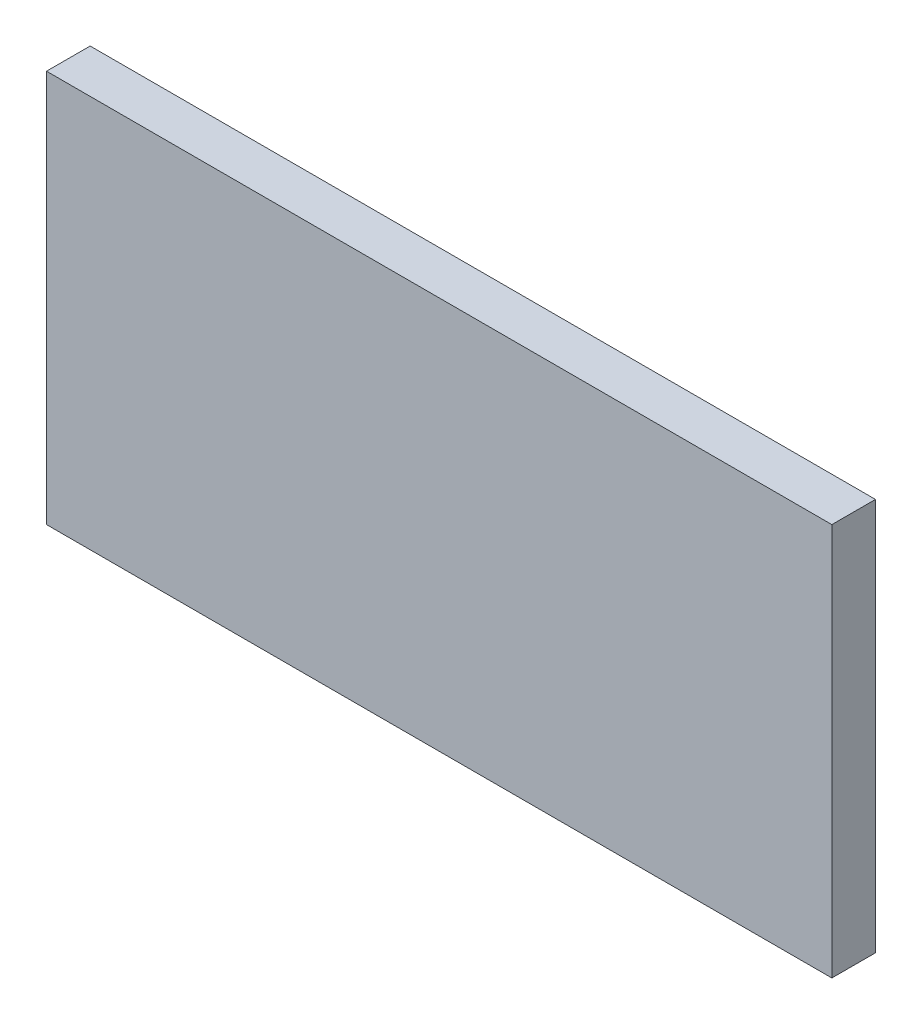
ISO-10303-21;
HEADER;
FILE_DESCRIPTION(('STEP AP214'),'2;1');
FILE_NAME('part.step','',(''),(''),'','','');
FILE_SCHEMA(('AUTOMOTIVE_DESIGN { 1 0 10303 214 1 1 1 1 }'));
ENDSEC;
DATA;
#1=APPLICATION_CONTEXT('core data for automotive mechanical design processes');
#2=APPLICATION_PROTOCOL_DEFINITION('international standard','automotive_design',2000,#1);
#3=PRODUCT_CONTEXT('',#1,'mechanical');
#4=PRODUCT('Part','Part','',(#3));
#5=PRODUCT_RELATED_PRODUCT_CATEGORY('part','',(#4));
#6=PRODUCT_DEFINITION_FORMATION('','',#4);
#7=PRODUCT_DEFINITION_CONTEXT('part definition',#1,'design');
#8=PRODUCT_DEFINITION('design','',#6,#7);
#9=PRODUCT_DEFINITION_SHAPE('','',#8);
#10=(LENGTH_UNIT() NAMED_UNIT(*) SI_UNIT(.MILLI.,.METRE.));
#11=(NAMED_UNIT(*) PLANE_ANGLE_UNIT() SI_UNIT($,.RADIAN.));
#12=(NAMED_UNIT(*) SI_UNIT($,.STERADIAN.) SOLID_ANGLE_UNIT());
#13=UNCERTAINTY_MEASURE_WITH_UNIT(LENGTH_MEASURE(1.E-05),#10,'distance_accuracy_value','');
#14=(GEOMETRIC_REPRESENTATION_CONTEXT(3) GLOBAL_UNCERTAINTY_ASSIGNED_CONTEXT((#13)) GLOBAL_UNIT_ASSIGNED_CONTEXT((#10,
#11,#12)) REPRESENTATION_CONTEXT('',''));
#15=CARTESIAN_POINT('',(0.,0.,0.));
#16=DIRECTION('',(0.,0.,1.));
#17=DIRECTION('',(1.,0.,0.));
#18=AXIS2_PLACEMENT_3D('',#15,#16,#17);
#19=CARTESIAN_POINT('',(0.,0.,0.));
#20=DIRECTION('',(0.,0.,1.));
#21=DIRECTION('',(1.,0.,0.));
#22=AXIS2_PLACEMENT_3D('',#19,#20,#21);
#23=PLANE('',#22);
#24=DIRECTION('',(1.,0.,0.));
#25=VECTOR('',#24,1.);
#26=CARTESIAN_POINT('',(0.9,0.45,0.));
#27=LINE('',#26,#25);
#28=CARTESIAN_POINT('',(0.9,0.45,0.));
#29=VERTEX_POINT('',#28);
#30=CARTESIAN_POINT('',(-0.9,0.45,0.));
#31=VERTEX_POINT('',#30);
#32=EDGE_CURVE('E79',#29,#31,#27,.F.);
#33=ORIENTED_EDGE('',*,*,#32,.F.);
#34=DIRECTION('',(0.,1.,0.));
#35=VECTOR('',#34,1.);
#36=CARTESIAN_POINT('',(0.9,-0.45,0.));
#37=LINE('',#36,#35);
#38=CARTESIAN_POINT('',(0.9,-0.45,0.));
#39=VERTEX_POINT('',#38);
#40=EDGE_CURVE('E55',#39,#29,#37,.T.);
#41=ORIENTED_EDGE('',*,*,#40,.F.);
#42=DIRECTION('',(1.,0.,0.));
#43=VECTOR('',#42,1.);
#44=CARTESIAN_POINT('',(-0.9,-0.45,0.));
#45=LINE('',#44,#43);
#46=CARTESIAN_POINT('',(-0.9,-0.45,0.));
#47=VERTEX_POINT('',#46);
#48=EDGE_CURVE('E57',#47,#39,#45,.T.);
#49=ORIENTED_EDGE('',*,*,#48,.F.);
#50=DIRECTION('',(0.,1.,0.));
#51=VECTOR('',#50,1.);
#52=CARTESIAN_POINT('',(-0.9,0.45,0.));
#53=LINE('',#52,#51);
#54=EDGE_CURVE('E20',#31,#47,#53,.F.);
#55=ORIENTED_EDGE('',*,*,#54,.F.);
#56=EDGE_LOOP('',(#33,#41,#49,#55));
#57=FACE_BOUND('',#56,.T.);
#58=ADVANCED_FACE('F17',(#57),#23,.F.);
#59=CARTESIAN_POINT('',(-0.9,0.45,0.));
#60=DIRECTION('',(-1.,0.,0.));
#61=DIRECTION('',(0.,0.,1.));
#62=AXIS2_PLACEMENT_3D('',#59,#60,#61);
#63=PLANE('',#62);
#64=DIRECTION('',(0.,1.,0.));
#65=VECTOR('',#64,1.);
#66=CARTESIAN_POINT('',(-0.9,0.,0.1));
#67=LINE('',#66,#65);
#68=CARTESIAN_POINT('',(-0.9,0.45,0.1));
#69=VERTEX_POINT('',#68);
#70=CARTESIAN_POINT('',(-0.9,-0.45,0.1));
#71=VERTEX_POINT('',#70);
#72=EDGE_CURVE('E83',#69,#71,#67,.F.);
#73=ORIENTED_EDGE('',*,*,#72,.F.);
#74=DIRECTION('',(0.,0.,1.));
#75=VECTOR('',#74,1.);
#76=CARTESIAN_POINT('',(-0.9,0.45,0.));
#77=LINE('',#76,#75);
#78=EDGE_CURVE('E68',#31,#69,#77,.T.);
#79=ORIENTED_EDGE('',*,*,#78,.F.);
#80=ORIENTED_EDGE('',*,*,#54,.T.);
#81=DIRECTION('',(0.,0.,-1.));
#82=VECTOR('',#81,1.);
#83=CARTESIAN_POINT('',(-0.9,-0.45,0.));
#84=LINE('',#83,#82);
#85=EDGE_CURVE('E63',#71,#47,#84,.T.);
#86=ORIENTED_EDGE('',*,*,#85,.F.);
#87=EDGE_LOOP('',(#73,#79,#80,#86));
#88=FACE_BOUND('',#87,.T.);
#89=ADVANCED_FACE('F65',(#88),#63,.T.);
#90=CARTESIAN_POINT('',(-0.9,-0.45,0.));
#91=DIRECTION('',(0.,-1.,0.));
#92=DIRECTION('',(0.,0.,-1.));
#93=AXIS2_PLACEMENT_3D('',#90,#91,#92);
#94=PLANE('',#93);
#95=DIRECTION('',(1.,0.,0.));
#96=VECTOR('',#95,1.);
#97=CARTESIAN_POINT('',(0.,-0.45,0.1));
#98=LINE('',#97,#96);
#99=CARTESIAN_POINT('',(0.9,-0.45,0.1));
#100=VERTEX_POINT('',#99);
#101=EDGE_CURVE('E72',#71,#100,#98,.T.);
#102=ORIENTED_EDGE('',*,*,#101,.F.);
#103=ORIENTED_EDGE('',*,*,#85,.T.);
#104=ORIENTED_EDGE('',*,*,#48,.T.);
#105=DIRECTION('',(0.,0.,-1.));
#106=VECTOR('',#105,1.);
#107=CARTESIAN_POINT('',(0.9,-0.45,0.));
#108=LINE('',#107,#106);
#109=EDGE_CURVE('E75',#100,#39,#108,.T.);
#110=ORIENTED_EDGE('',*,*,#109,.F.);
#111=EDGE_LOOP('',(#102,#103,#104,#110));
#112=FACE_BOUND('',#111,.T.);
#113=ADVANCED_FACE('F70',(#112),#94,.T.);
#114=CARTESIAN_POINT('',(0.9,-0.45,0.));
#115=DIRECTION('',(1.,0.,0.));
#116=DIRECTION('',(0.,0.,-1.));
#117=AXIS2_PLACEMENT_3D('',#114,#115,#116);
#118=PLANE('',#117);
#119=DIRECTION('',(0.,1.,0.));
#120=VECTOR('',#119,1.);
#121=CARTESIAN_POINT('',(0.9,0.,0.1));
#122=LINE('',#121,#120);
#123=CARTESIAN_POINT('',(0.9,0.45,0.1));
#124=VERTEX_POINT('',#123);
#125=EDGE_CURVE('E26',#100,#124,#122,.T.);
#126=ORIENTED_EDGE('',*,*,#125,.F.);
#127=ORIENTED_EDGE('',*,*,#109,.T.);
#128=ORIENTED_EDGE('',*,*,#40,.T.);
#129=DIRECTION('',(0.,0.,1.));
#130=VECTOR('',#129,1.);
#131=CARTESIAN_POINT('',(0.9,0.45,0.));
#132=LINE('',#131,#130);
#133=EDGE_CURVE('E35',#124,#29,#132,.F.);
#134=ORIENTED_EDGE('',*,*,#133,.F.);
#135=EDGE_LOOP('',(#126,#127,#128,#134));
#136=FACE_BOUND('',#135,.T.);
#137=ADVANCED_FACE('F89',(#136),#118,.T.);
#138=CARTESIAN_POINT('',(0.9,0.45,0.));
#139=DIRECTION('',(0.,1.,0.));
#140=DIRECTION('',(0.,0.,1.));
#141=AXIS2_PLACEMENT_3D('',#138,#139,#140);
#142=PLANE('',#141);
#143=DIRECTION('',(1.,0.,0.));
#144=VECTOR('',#143,1.);
#145=CARTESIAN_POINT('',(0.,0.45,0.1));
#146=LINE('',#145,#144);
#147=EDGE_CURVE('E11',#124,#69,#146,.F.);
#148=ORIENTED_EDGE('',*,*,#147,.F.);
#149=ORIENTED_EDGE('',*,*,#133,.T.);
#150=ORIENTED_EDGE('',*,*,#32,.T.);
#151=ORIENTED_EDGE('',*,*,#78,.T.);
#152=EDGE_LOOP('',(#148,#149,#150,#151));
#153=FACE_BOUND('',#152,.T.);
#154=ADVANCED_FACE('F91',(#153),#142,.T.);
#155=CARTESIAN_POINT('',(0.,0.,0.1));
#156=DIRECTION('',(0.,0.,1.));
#157=DIRECTION('',(1.,0.,0.));
#158=AXIS2_PLACEMENT_3D('',#155,#156,#157);
#159=PLANE('',#158);
#160=ORIENTED_EDGE('',*,*,#125,.T.);
#161=ORIENTED_EDGE('',*,*,#147,.T.);
#162=ORIENTED_EDGE('',*,*,#72,.T.);
#163=ORIENTED_EDGE('',*,*,#101,.T.);
#164=EDGE_LOOP('',(#160,#161,#162,#163));
#165=FACE_BOUND('',#164,.T.);
#166=ADVANCED_FACE('F88',(#165),#159,.T.);
#167=CLOSED_SHELL('',(#58,#89,#113,#137,#154,#166));
#168=MANIFOLD_SOLID_BREP('B1',#167);
#169=ADVANCED_BREP_SHAPE_REPRESENTATION('',(#18,#168),#14);
#170=SHAPE_DEFINITION_REPRESENTATION(#9,#169);
ENDSEC;
END-ISO-10303-21;
